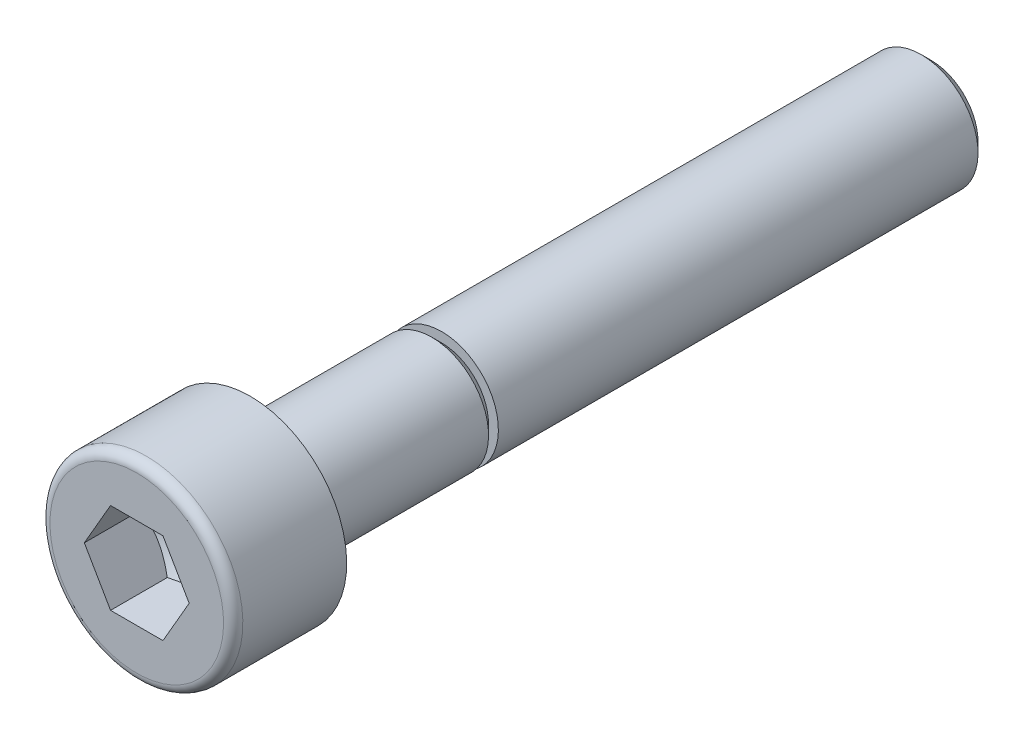
ISO-10303-21;
HEADER;
FILE_DESCRIPTION(('STEP AP214'),'2;1');
FILE_NAME('part.step','',(''),(''),'','','');
FILE_SCHEMA(('AUTOMOTIVE_DESIGN { 1 0 10303 214 1 1 1 1 }'));
ENDSEC;
DATA;
#1=APPLICATION_CONTEXT('core data for automotive mechanical design processes');
#2=APPLICATION_PROTOCOL_DEFINITION('international standard','automotive_design',2000,#1);
#3=PRODUCT_CONTEXT('',#1,'mechanical');
#4=PRODUCT('Part','Part','',(#3));
#5=PRODUCT_RELATED_PRODUCT_CATEGORY('part','',(#4));
#6=PRODUCT_DEFINITION_FORMATION('','',#4);
#7=PRODUCT_DEFINITION_CONTEXT('part definition',#1,'design');
#8=PRODUCT_DEFINITION('design','',#6,#7);
#9=PRODUCT_DEFINITION_SHAPE('','',#8);
#10=(LENGTH_UNIT() NAMED_UNIT(*) SI_UNIT(.MILLI.,.METRE.));
#11=(NAMED_UNIT(*) PLANE_ANGLE_UNIT() SI_UNIT($,.RADIAN.));
#12=(NAMED_UNIT(*) SI_UNIT($,.STERADIAN.) SOLID_ANGLE_UNIT());
#13=UNCERTAINTY_MEASURE_WITH_UNIT(LENGTH_MEASURE(1.E-05),#10,'distance_accuracy_value','');
#14=(GEOMETRIC_REPRESENTATION_CONTEXT(3) GLOBAL_UNCERTAINTY_ASSIGNED_CONTEXT((#13)) GLOBAL_UNIT_ASSIGNED_CONTEXT((#10,
#11,#12)) REPRESENTATION_CONTEXT('',''));
#15=CARTESIAN_POINT('',(0.,0.,0.));
#16=DIRECTION('',(0.,0.,1.));
#17=DIRECTION('',(1.,0.,0.));
#18=AXIS2_PLACEMENT_3D('',#15,#16,#17);
#19=CARTESIAN_POINT('',(0.,0.,1.83333364416674));
#20=DIRECTION('',(0.,0.,0.999999999999998));
#21=DIRECTION('',(0.,1.,0.));
#22=AXIS2_PLACEMENT_3D('',#19,#20,#21);
#23=CONICAL_SURFACE('',#22,1.1547,1.0471975511966);
#24=CARTESIAN_POINT('',(1.1547,1.99999906749979,2.49999999999999));
#25=CARTESIAN_POINT('',(1.73204999999995,0.999999533749846,2.16666682208336));
#26=CARTESIAN_POINT('',(2.3094,0.,2.49999999999999));
#27=(BOUNDED_CURVE() B_SPLINE_CURVE(2,(#24,#25,#26),.UNSPECIFIED.,.F.,
.F.) B_SPLINE_CURVE_WITH_KNOTS((3,3),(0.,2.33687118658889),
.UNSPECIFIED.) CURVE() GEOMETRIC_REPRESENTATION_ITEM() RATIONAL_B_SPLINE_CURVE((1.,
1.15470053837925,1.)) REPRESENTATION_ITEM(''));
#28=CARTESIAN_POINT('',(1.1547,1.99999906749979,2.49999999999999));
#29=VERTEX_POINT('',#28);
#30=CARTESIAN_POINT('',(2.3094,0.,2.49999999999999));
#31=VERTEX_POINT('',#30);
#32=EDGE_CURVE('E163',#29,#31,#27,.T.);
#33=ORIENTED_EDGE('',*,*,#32,.F.);
#34=CARTESIAN_POINT('',(-1.15470000000001,1.99999906749983,2.49999999999999));
#35=CARTESIAN_POINT('',(0.,1.99999906749978,2.16666682208336));
#36=CARTESIAN_POINT('',(1.1547,1.99999906749978,2.49999999999999));
#37=(BOUNDED_CURVE() B_SPLINE_CURVE(2,(#34,#35,#36),.UNSPECIFIED.,.F.,
.F.) B_SPLINE_CURVE_WITH_KNOTS((3,3),(0.,2.33687118658889),
.UNSPECIFIED.) CURVE() GEOMETRIC_REPRESENTATION_ITEM() RATIONAL_B_SPLINE_CURVE((1.,
1.15470053837925,1.)) REPRESENTATION_ITEM(''));
#38=CARTESIAN_POINT('',(-1.15470000000001,1.99999906749983,2.49999999999999));
#39=VERTEX_POINT('',#38);
#40=EDGE_CURVE('E46',#39,#29,#37,.T.);
#41=ORIENTED_EDGE('',*,*,#40,.F.);
#42=CARTESIAN_POINT('',(-2.3094,0.,2.49999999999993));
#43=CARTESIAN_POINT('',(-1.73205000000006,0.999999533749915,2.16666682208336));
#44=CARTESIAN_POINT('',(-1.15470000000001,1.99999906749983,2.49999999999999));
#45=(BOUNDED_CURVE() B_SPLINE_CURVE(2,(#42,#43,#44),.UNSPECIFIED.,.F.,
.F.) B_SPLINE_CURVE_WITH_KNOTS((3,3),(0.,2.33687118658889),
.UNSPECIFIED.) CURVE() GEOMETRIC_REPRESENTATION_ITEM() RATIONAL_B_SPLINE_CURVE((1.,
1.15470053837925,1.)) REPRESENTATION_ITEM(''));
#46=CARTESIAN_POINT('',(-2.3094,0.,2.49999999999993));
#47=VERTEX_POINT('',#46);
#48=EDGE_CURVE('E139',#47,#39,#45,.T.);
#49=ORIENTED_EDGE('',*,*,#48,.F.);
#50=CARTESIAN_POINT('',(-1.1547,-1.99999906749978,2.49999999999993));
#51=CARTESIAN_POINT('',(-1.73205,-0.999999533749892,2.16666682208337));
#52=CARTESIAN_POINT('',(-2.3094,0.,2.49999999999993));
#53=(BOUNDED_CURVE() B_SPLINE_CURVE(2,(#50,#51,#52),.UNSPECIFIED.,.F.,
.F.) B_SPLINE_CURVE_WITH_KNOTS((3,3),(0.,2.33687118658889),
.UNSPECIFIED.) CURVE() GEOMETRIC_REPRESENTATION_ITEM() RATIONAL_B_SPLINE_CURVE((1.,
1.15470053837925,1.)) REPRESENTATION_ITEM(''));
#54=CARTESIAN_POINT('',(-1.1547,-1.99999906749979,2.49999999999993));
#55=VERTEX_POINT('',#54);
#56=EDGE_CURVE('E13',#55,#47,#53,.T.);
#57=ORIENTED_EDGE('',*,*,#56,.F.);
#58=CARTESIAN_POINT('',(1.1547,-1.9999990674998,2.49999999999999));
#59=CARTESIAN_POINT('',(0.,-1.99999906749978,2.16666682208336));
#60=CARTESIAN_POINT('',(-1.1547,-1.99999906749978,2.49999999999993));
#61=(BOUNDED_CURVE() B_SPLINE_CURVE(2,(#58,#59,#60),.UNSPECIFIED.,.F.,
.F.) B_SPLINE_CURVE_WITH_KNOTS((3,3),(0.,2.33687118658889),
.UNSPECIFIED.) CURVE() GEOMETRIC_REPRESENTATION_ITEM() RATIONAL_B_SPLINE_CURVE((1.,
1.15470053837925,1.)) REPRESENTATION_ITEM(''));
#62=CARTESIAN_POINT('',(1.1547,-1.9999990674998,2.49999999999999));
#63=VERTEX_POINT('',#62);
#64=EDGE_CURVE('E135',#63,#55,#61,.T.);
#65=ORIENTED_EDGE('',*,*,#64,.F.);
#66=CARTESIAN_POINT('',(2.30939999999999,0.,2.49999999999999));
#67=CARTESIAN_POINT('',(1.73205,-0.999999533749892,2.16666682208337));
#68=CARTESIAN_POINT('',(1.1547,-1.9999990674998,2.49999999999999));
#69=(BOUNDED_CURVE() B_SPLINE_CURVE(2,(#66,#67,#68),.UNSPECIFIED.,.F.,
.F.) B_SPLINE_CURVE_WITH_KNOTS((3,3),(0.,2.33687118658888),
.UNSPECIFIED.) CURVE() GEOMETRIC_REPRESENTATION_ITEM() RATIONAL_B_SPLINE_CURVE((1.,
1.15470053837925,1.)) REPRESENTATION_ITEM(''));
#70=EDGE_CURVE('E201',#31,#63,#69,.T.);
#71=ORIENTED_EDGE('',*,*,#70,.F.);
#72=EDGE_LOOP('',(#33,#41,#49,#57,#65,#71));
#73=FACE_BOUND('',#72,.T.);
#74=CARTESIAN_POINT('',(0.,0.,1.16666728833348));
#75=VERTEX_POINT('',#74);
#76=VERTEX_LOOP('',#75);
#77=FACE_BOUND('',#76,.T.);
#78=ADVANCED_FACE('F27',(#73,#77),#23,.F.);
#79=CARTESIAN_POINT('',(-1.73205,-0.9999995337499,4.99999999999993));
#80=DIRECTION('',(-0.866025403784442,-0.500000000000002,0.));
#81=DIRECTION('',(-0.500000000000002,0.866025403784442,0.));
#82=AXIS2_PLACEMENT_3D('',#79,#80,#81);
#83=PLANE('',#82);
#84=ORIENTED_EDGE('',*,*,#56,.T.);
#85=DIRECTION('',(0.,0.,-0.999999999999998));
#86=VECTOR('',#85,1.);
#87=CARTESIAN_POINT('',(-2.3094,0.,4.99999999999993));
#88=LINE('',#87,#86);
#89=CARTESIAN_POINT('',(-2.3094,0.,4.99999999999993));
#90=VERTEX_POINT('',#89);
#91=EDGE_CURVE('E146',#90,#47,#88,.T.);
#92=ORIENTED_EDGE('',*,*,#91,.F.);
#93=DIRECTION('',(-0.500000000000002,0.866025403784442,0.));
#94=VECTOR('',#93,1.);
#95=CARTESIAN_POINT('',(-2.14611839618444,-0.282812033749889,4.99999999999993));
#96=LINE('',#95,#94);
#97=CARTESIAN_POINT('',(-1.1547,-1.99999906749978,4.99999999999993));
#98=VERTEX_POINT('',#97);
#99=EDGE_CURVE('E174',#98,#90,#96,.T.);
#100=ORIENTED_EDGE('',*,*,#99,.F.);
#101=DIRECTION('',(0.,0.,-0.999999999999998));
#102=VECTOR('',#101,1.);
#103=CARTESIAN_POINT('',(-1.1547,-1.99999906749978,4.99999999999993));
#104=LINE('',#103,#102);
#105=EDGE_CURVE('E37',#98,#55,#104,.T.);
#106=ORIENTED_EDGE('',*,*,#105,.T.);
#107=EDGE_LOOP('',(#84,#92,#100,#106));
#108=FACE_BOUND('',#107,.T.);
#109=ADVANCED_FACE('F29',(#108),#83,.F.);
#110=CARTESIAN_POINT('',(0.,-1.99999906749978,4.99999999999993));
#111=DIRECTION('',(0.,-1.,0.));
#112=DIRECTION('',(-1.,0.,0.));
#113=AXIS2_PLACEMENT_3D('',#110,#111,#112);
#114=PLANE('',#113);
#115=ORIENTED_EDGE('',*,*,#64,.T.);
#116=ORIENTED_EDGE('',*,*,#105,.F.);
#117=DIRECTION('',(-1.,0.,0.));
#118=VECTOR('',#117,1.);
#119=CARTESIAN_POINT('',(0.,-1.99999906749978,4.99999999999993));
#120=LINE('',#119,#118);
#121=CARTESIAN_POINT('',(1.1547,-1.9999990674998,5.));
#122=VERTEX_POINT('',#121);
#123=EDGE_CURVE('E176',#122,#98,#120,.T.);
#124=ORIENTED_EDGE('',*,*,#123,.F.);
#125=DIRECTION('',(0.,0.,-0.999999999999998));
#126=VECTOR('',#125,1.);
#127=CARTESIAN_POINT('',(1.1547,-1.9999990674998,5.));
#128=LINE('',#127,#126);
#129=EDGE_CURVE('E138',#122,#63,#128,.T.);
#130=ORIENTED_EDGE('',*,*,#129,.T.);
#131=EDGE_LOOP('',(#115,#116,#124,#130));
#132=FACE_BOUND('',#131,.T.);
#133=ADVANCED_FACE('F250',(#132),#114,.F.);
#134=CARTESIAN_POINT('',(1.73205,-0.999999533749893,5.));
#135=DIRECTION('',(0.866025403784442,-0.500000000000002,0.));
#136=DIRECTION('',(-0.500000000000002,-0.866025403784442,0.));
#137=AXIS2_PLACEMENT_3D('',#134,#135,#136);
#138=PLANE('',#137);
#139=ORIENTED_EDGE('',*,*,#70,.T.);
#140=ORIENTED_EDGE('',*,*,#129,.F.);
#141=DIRECTION('',(-0.500000000000002,-0.866025403784442,0.));
#142=VECTOR('',#141,1.);
#143=CARTESIAN_POINT('',(2.14611839618442,-0.282812033749913,5.));
#144=LINE('',#143,#142);
#145=CARTESIAN_POINT('',(2.3094,0.,5.));
#146=VERTEX_POINT('',#145);
#147=EDGE_CURVE('E106',#146,#122,#144,.T.);
#148=ORIENTED_EDGE('',*,*,#147,.F.);
#149=DIRECTION('',(0.,0.,-0.999999999999998));
#150=VECTOR('',#149,1.);
#151=CARTESIAN_POINT('',(2.3094,0.,5.));
#152=LINE('',#151,#150);
#153=EDGE_CURVE('E31',#146,#31,#152,.T.);
#154=ORIENTED_EDGE('',*,*,#153,.T.);
#155=EDGE_LOOP('',(#139,#140,#148,#154));
#156=FACE_BOUND('',#155,.T.);
#157=ADVANCED_FACE('F255',(#156),#138,.F.);
#158=CARTESIAN_POINT('',(1.73205,0.999999533749948,5.));
#159=DIRECTION('',(0.866025403784442,0.500000000000002,0.));
#160=DIRECTION('',(0.500000000000002,-0.866025403784442,0.));
#161=AXIS2_PLACEMENT_3D('',#158,#159,#160);
#162=PLANE('',#161);
#163=ORIENTED_EDGE('',*,*,#32,.T.);
#164=ORIENTED_EDGE('',*,*,#153,.F.);
#165=DIRECTION('',(0.500000000000002,-0.866025403784442,0.));
#166=VECTOR('',#165,1.);
#167=CARTESIAN_POINT('',(1.31798160381556,1.71718703374989,5.));
#168=LINE('',#167,#166);
#169=CARTESIAN_POINT('',(1.1547,1.99999906749978,5.));
#170=VERTEX_POINT('',#169);
#171=EDGE_CURVE('E99',#170,#146,#168,.T.);
#172=ORIENTED_EDGE('',*,*,#171,.F.);
#173=DIRECTION('',(0.,0.,-0.999999999999998));
#174=VECTOR('',#173,1.);
#175=CARTESIAN_POINT('',(1.1547,1.99999906749978,5.));
#176=LINE('',#175,#174);
#177=EDGE_CURVE('E180',#170,#29,#176,.T.);
#178=ORIENTED_EDGE('',*,*,#177,.T.);
#179=EDGE_LOOP('',(#163,#164,#172,#178));
#180=FACE_BOUND('',#179,.T.);
#181=ADVANCED_FACE('F258',(#180),#162,.F.);
#182=CARTESIAN_POINT('',(0.,1.99999906749982,5.));
#183=DIRECTION('',(0.,1.,0.));
#184=DIRECTION('',(1.,0.,0.));
#185=AXIS2_PLACEMENT_3D('',#182,#183,#184);
#186=PLANE('',#185);
#187=ORIENTED_EDGE('',*,*,#40,.T.);
#188=ORIENTED_EDGE('',*,*,#177,.F.);
#189=DIRECTION('',(1.,0.,0.));
#190=VECTOR('',#189,1.);
#191=CARTESIAN_POINT('',(0.,1.99999906749984,5.));
#192=LINE('',#191,#190);
#193=CARTESIAN_POINT('',(-1.1547,1.99999906749984,5.));
#194=VERTEX_POINT('',#193);
#195=EDGE_CURVE('E175',#194,#170,#192,.T.);
#196=ORIENTED_EDGE('',*,*,#195,.F.);
#197=DIRECTION('',(0.,0.,-0.999999999999998));
#198=VECTOR('',#197,1.);
#199=CARTESIAN_POINT('',(-1.1547,1.99999906749984,5.));
#200=LINE('',#199,#198);
#201=EDGE_CURVE('E145',#194,#39,#200,.T.);
#202=ORIENTED_EDGE('',*,*,#201,.T.);
#203=EDGE_LOOP('',(#187,#188,#196,#202));
#204=FACE_BOUND('',#203,.T.);
#205=ADVANCED_FACE('F266',(#204),#186,.F.);
#206=CARTESIAN_POINT('',(-1.73205,0.999999533749893,4.99999999999993));
#207=DIRECTION('',(-0.866025403784442,0.500000000000002,0.));
#208=DIRECTION('',(0.500000000000002,0.866025403784442,0.));
#209=AXIS2_PLACEMENT_3D('',#206,#207,#208);
#210=PLANE('',#209);
#211=ORIENTED_EDGE('',*,*,#48,.T.);
#212=ORIENTED_EDGE('',*,*,#201,.F.);
#213=DIRECTION('',(0.500000000000002,0.866025403784442,0.));
#214=VECTOR('',#213,1.);
#215=CARTESIAN_POINT('',(-1.31798160381557,1.71718703374989,5.));
#216=LINE('',#215,#214);
#217=EDGE_CURVE('E171',#90,#194,#216,.T.);
#218=ORIENTED_EDGE('',*,*,#217,.F.);
#219=ORIENTED_EDGE('',*,*,#91,.T.);
#220=EDGE_LOOP('',(#211,#212,#218,#219));
#221=FACE_BOUND('',#220,.T.);
#222=ADVANCED_FACE('F227',(#221),#210,.F.);
#223=CARTESIAN_POINT('',(0.,0.,4.57499999999999));
#224=DIRECTION('',(0.,0.,-0.999999999999998));
#225=DIRECTION('',(-1.,0.,0.));
#226=AXIS2_PLACEMENT_3D('',#223,#224,#225);
#227=TOROIDAL_SURFACE('',#226,3.825,0.425);
#228=CARTESIAN_POINT('',(0.,0.,4.57499999999999));
#229=DIRECTION('',(0.,0.,-0.999999999999998));
#230=DIRECTION('',(0.,1.,0.));
#231=AXIS2_PLACEMENT_3D('',#228,#229,#230);
#232=CIRCLE('',#231,4.25);
#233=CARTESIAN_POINT('',(0.,4.25000000000005,4.57499999999999));
#234=VERTEX_POINT('',#233);
#235=EDGE_CURVE('E160',#234,#234,#232,.T.);
#236=ORIENTED_EDGE('',*,*,#235,.F.);
#237=EDGE_LOOP('',(#236));
#238=FACE_BOUND('',#237,.T.);
#239=CARTESIAN_POINT('',(0.,0.,5.));
#240=DIRECTION('',(0.,0.,-0.999999999999998));
#241=DIRECTION('',(0.,1.,0.));
#242=AXIS2_PLACEMENT_3D('',#239,#240,#241);
#243=CIRCLE('',#242,3.825);
#244=CARTESIAN_POINT('',(0.,3.825,5.));
#245=VERTEX_POINT('',#244);
#246=EDGE_CURVE('E155',#245,#245,#243,.T.);
#247=ORIENTED_EDGE('',*,*,#246,.T.);
#248=EDGE_LOOP('',(#247));
#249=FACE_BOUND('',#248,.T.);
#250=ADVANCED_FACE('F222',(#238,#249),#227,.T.);
#251=CARTESIAN_POINT('',(0.,0.,2.2875));
#252=DIRECTION('',(0.,0.,0.999999999999998));
#253=DIRECTION('',(0.,1.,0.));
#254=AXIS2_PLACEMENT_3D('',#251,#252,#253);
#255=CYLINDRICAL_SURFACE('',#254,4.25);
#256=CARTESIAN_POINT('',(0.,0.,0.));
#257=DIRECTION('',(0.,0.,-0.999999999999998));
#258=DIRECTION('',(0.,1.,0.));
#259=AXIS2_PLACEMENT_3D('',#256,#257,#258);
#260=CIRCLE('',#259,4.25);
#261=CARTESIAN_POINT('',(0.,4.25000000000005,0.));
#262=VERTEX_POINT('',#261);
#263=EDGE_CURVE('E127',#262,#262,#260,.T.);
#264=ORIENTED_EDGE('',*,*,#263,.F.);
#265=EDGE_LOOP('',(#264));
#266=FACE_BOUND('',#265,.T.);
#267=ORIENTED_EDGE('',*,*,#235,.T.);
#268=EDGE_LOOP('',(#267));
#269=FACE_BOUND('',#268,.T.);
#270=ADVANCED_FACE('F219',(#266,#269),#255,.T.);
#271=CARTESIAN_POINT('',(0.,3.5,0.));
#272=DIRECTION('',(0.,0.,-0.999999999999998));
#273=DIRECTION('',(0.,1.,0.));
#274=AXIS2_PLACEMENT_3D('',#271,#272,#273);
#275=PLANE('',#274);
#276=CARTESIAN_POINT('',(0.,0.,0.));
#277=DIRECTION('',(0.,0.,-0.999999999999998));
#278=DIRECTION('',(0.,1.,0.));
#279=AXIS2_PLACEMENT_3D('',#276,#277,#278);
#280=CIRCLE('',#279,2.75);
#281=CARTESIAN_POINT('',(0.,2.75,0.));
#282=VERTEX_POINT('',#281);
#283=EDGE_CURVE('E123',#282,#282,#280,.T.);
#284=ORIENTED_EDGE('',*,*,#283,.F.);
#285=EDGE_LOOP('',(#284));
#286=FACE_BOUND('',#285,.T.);
#287=ORIENTED_EDGE('',*,*,#263,.T.);
#288=EDGE_LOOP('',(#287));
#289=FACE_BOUND('',#288,.T.);
#290=ADVANCED_FACE('F217',(#286,#289),#275,.T.);
#291=CARTESIAN_POINT('',(0.,0.,-0.25));
#292=DIRECTION('',(0.,0.,-0.999999999999998));
#293=DIRECTION('',(-1.,0.,0.));
#294=AXIS2_PLACEMENT_3D('',#291,#292,#293);
#295=TOROIDAL_SURFACE('',#294,2.75,0.25);
#296=CARTESIAN_POINT('',(0.,0.,-0.25));
#297=DIRECTION('',(0.,0.,-0.999999999999998));
#298=DIRECTION('',(0.,1.,0.));
#299=AXIS2_PLACEMENT_3D('',#296,#297,#298);
#300=CIRCLE('',#299,2.5);
#301=CARTESIAN_POINT('',(0.,2.5,-0.25));
#302=VERTEX_POINT('',#301);
#303=EDGE_CURVE('E119',#302,#302,#300,.T.);
#304=ORIENTED_EDGE('',*,*,#303,.F.);
#305=EDGE_LOOP('',(#304));
#306=FACE_BOUND('',#305,.T.);
#307=ORIENTED_EDGE('',*,*,#283,.T.);
#308=EDGE_LOOP('',(#307));
#309=FACE_BOUND('',#308,.T.);
#310=ADVANCED_FACE('F120',(#306,#309),#295,.F.);
#311=CARTESIAN_POINT('',(0.,0.,-4.125));
#312=DIRECTION('',(0.,0.,0.999999999999998));
#313=DIRECTION('',(0.,1.,0.));
#314=AXIS2_PLACEMENT_3D('',#311,#312,#313);
#315=CYLINDRICAL_SURFACE('',#314,2.5);
#316=CARTESIAN_POINT('',(0.,0.,-7.99999999999996));
#317=DIRECTION('',(0.,0.,-0.999999999999998));
#318=DIRECTION('',(0.,1.,0.));
#319=AXIS2_PLACEMENT_3D('',#316,#317,#318);
#320=CIRCLE('',#319,2.5);
#321=CARTESIAN_POINT('',(0.,2.5,-7.99999999999998));
#322=VERTEX_POINT('',#321);
#323=EDGE_CURVE('E124',#322,#322,#320,.T.);
#324=ORIENTED_EDGE('',*,*,#323,.F.);
#325=EDGE_LOOP('',(#324));
#326=FACE_BOUND('',#325,.T.);
#327=ORIENTED_EDGE('',*,*,#303,.T.);
#328=EDGE_LOOP('',(#327));
#329=FACE_BOUND('',#328,.T.);
#330=ADVANCED_FACE('F259',(#326,#329),#315,.T.);
#331=CARTESIAN_POINT('',(0.,0.,-8.21649999999996));
#332=DIRECTION('',(0.,0.,0.999999999999998));
#333=DIRECTION('',(0.,1.,0.));
#334=AXIS2_PLACEMENT_3D('',#331,#332,#333);
#335=CONICAL_SURFACE('',#334,2.2835,0.785398163397449);
#336=CARTESIAN_POINT('',(0.,0.,-8.43299999999996));
#337=DIRECTION('',(0.,0.,-0.999999999999998));
#338=DIRECTION('',(0.,1.,0.));
#339=AXIS2_PLACEMENT_3D('',#336,#337,#338);
#340=CIRCLE('',#339,2.067);
#341=CARTESIAN_POINT('',(0.,2.067,-8.43299999999998));
#342=VERTEX_POINT('',#341);
#343=EDGE_CURVE('E130',#342,#342,#340,.T.);
#344=ORIENTED_EDGE('',*,*,#343,.F.);
#345=EDGE_LOOP('',(#344));
#346=FACE_BOUND('',#345,.T.);
#347=ORIENTED_EDGE('',*,*,#323,.T.);
#348=EDGE_LOOP('',(#347));
#349=FACE_BOUND('',#348,.T.);
#350=ADVANCED_FACE('F262',(#346,#349),#335,.T.);
#351=CARTESIAN_POINT('',(0.,2.2835,-8.43299999999998));
#352=DIRECTION('',(0.,0.,0.999999999999998));
#353=DIRECTION('',(0.,-1.,0.));
#354=AXIS2_PLACEMENT_3D('',#351,#352,#353);
#355=PLANE('',#354);
#356=CARTESIAN_POINT('',(0.,0.,-8.43299999999996));
#357=DIRECTION('',(0.,0.,-0.999999999999998));
#358=DIRECTION('',(0.,1.,0.));
#359=AXIS2_PLACEMENT_3D('',#356,#357,#358);
#360=CIRCLE('',#359,2.5);
#361=CARTESIAN_POINT('',(0.,2.5,-8.43299999999998));
#362=VERTEX_POINT('',#361);
#363=EDGE_CURVE('E170',#362,#362,#360,.T.);
#364=ORIENTED_EDGE('',*,*,#363,.F.);
#365=EDGE_LOOP('',(#364));
#366=FACE_BOUND('',#365,.T.);
#367=ORIENTED_EDGE('',*,*,#343,.T.);
#368=EDGE_LOOP('',(#367));
#369=FACE_BOUND('',#368,.T.);
#370=ADVANCED_FACE('F275',(#366,#369),#355,.T.);
#371=CARTESIAN_POINT('',(0.,0.,-18.9999999999999));
#372=DIRECTION('',(0.,0.,0.999999999999998));
#373=DIRECTION('',(0.,1.,0.));
#374=AXIS2_PLACEMENT_3D('',#371,#372,#373);
#375=CYLINDRICAL_SURFACE('',#374,2.5);
#376=CARTESIAN_POINT('',(0.,0.,-29.5669999999999));
#377=DIRECTION('',(0.,0.,-0.999999999999998));
#378=DIRECTION('',(0.,1.,0.));
#379=AXIS2_PLACEMENT_3D('',#376,#377,#378);
#380=CIRCLE('',#379,2.5);
#381=CARTESIAN_POINT('',(0.,2.50000000000004,-29.5669999999999));
#382=VERTEX_POINT('',#381);
#383=EDGE_CURVE('E185',#382,#382,#380,.T.);
#384=ORIENTED_EDGE('',*,*,#383,.F.);
#385=EDGE_LOOP('',(#384));
#386=FACE_BOUND('',#385,.T.);
#387=ORIENTED_EDGE('',*,*,#363,.T.);
#388=EDGE_LOOP('',(#387));
#389=FACE_BOUND('',#388,.T.);
#390=ADVANCED_FACE('F271',(#386,#389),#375,.T.);
#391=CARTESIAN_POINT('',(0.,0.,-29.7834999999999));
#392=DIRECTION('',(0.,0.,0.999999999999998));
#393=DIRECTION('',(0.,1.,0.));
#394=AXIS2_PLACEMENT_3D('',#391,#392,#393);
#395=CONICAL_SURFACE('',#394,2.2835,0.785398163397448);
#396=CARTESIAN_POINT('',(0.,0.,-29.9999999999999));
#397=DIRECTION('',(0.,0.,-0.999999999999998));
#398=DIRECTION('',(0.,1.,0.));
#399=AXIS2_PLACEMENT_3D('',#396,#397,#398);
#400=CIRCLE('',#399,2.067);
#401=CARTESIAN_POINT('',(0.,2.067,-29.9999999999999));
#402=VERTEX_POINT('',#401);
#403=EDGE_CURVE('E188',#402,#402,#400,.T.);
#404=ORIENTED_EDGE('',*,*,#403,.F.);
#405=EDGE_LOOP('',(#404));
#406=FACE_BOUND('',#405,.T.);
#407=ORIENTED_EDGE('',*,*,#383,.T.);
#408=EDGE_LOOP('',(#407));
#409=FACE_BOUND('',#408,.T.);
#410=ADVANCED_FACE('F239',(#406,#409),#395,.T.);
#411=CARTESIAN_POINT('',(0.,1.0335,-29.9999999999999));
#412=DIRECTION('',(0.,0.,-0.999999999999998));
#413=DIRECTION('',(0.,1.,0.));
#414=AXIS2_PLACEMENT_3D('',#411,#412,#413);
#415=PLANE('',#414);
#416=ORIENTED_EDGE('',*,*,#403,.T.);
#417=EDGE_LOOP('',(#416));
#418=FACE_BOUND('',#417,.T.);
#419=ADVANCED_FACE('F232',(#418),#415,.T.);
#420=CARTESIAN_POINT('',(0.,1.91249999999999,5.));
#421=DIRECTION('',(0.,0.,0.999999999999998));
#422=DIRECTION('',(0.,-1.,0.));
#423=AXIS2_PLACEMENT_3D('',#420,#421,#422);
#424=PLANE('',#423);
#425=ORIENTED_EDGE('',*,*,#99,.T.);
#426=ORIENTED_EDGE('',*,*,#217,.T.);
#427=ORIENTED_EDGE('',*,*,#195,.T.);
#428=ORIENTED_EDGE('',*,*,#171,.T.);
#429=ORIENTED_EDGE('',*,*,#147,.T.);
#430=ORIENTED_EDGE('',*,*,#123,.T.);
#431=EDGE_LOOP('',(#425,#426,#427,#428,#429,#430));
#432=FACE_BOUND('',#431,.T.);
#433=ORIENTED_EDGE('',*,*,#246,.F.);
#434=EDGE_LOOP('',(#433));
#435=FACE_BOUND('',#434,.T.);
#436=ADVANCED_FACE('F230',(#432,#435),#424,.T.);
#437=CLOSED_SHELL('',(#78,#109,#133,#157,#181,#205,#222,#250,#270,#290,#310,#330,#350,#370,#390,
#410,#419,#436));
#438=MANIFOLD_SOLID_BREP('B1',#437);
#439=ADVANCED_BREP_SHAPE_REPRESENTATION('',(#18,#438),#14);
#440=SHAPE_DEFINITION_REPRESENTATION(#9,#439);
ENDSEC;
END-ISO-10303-21;
